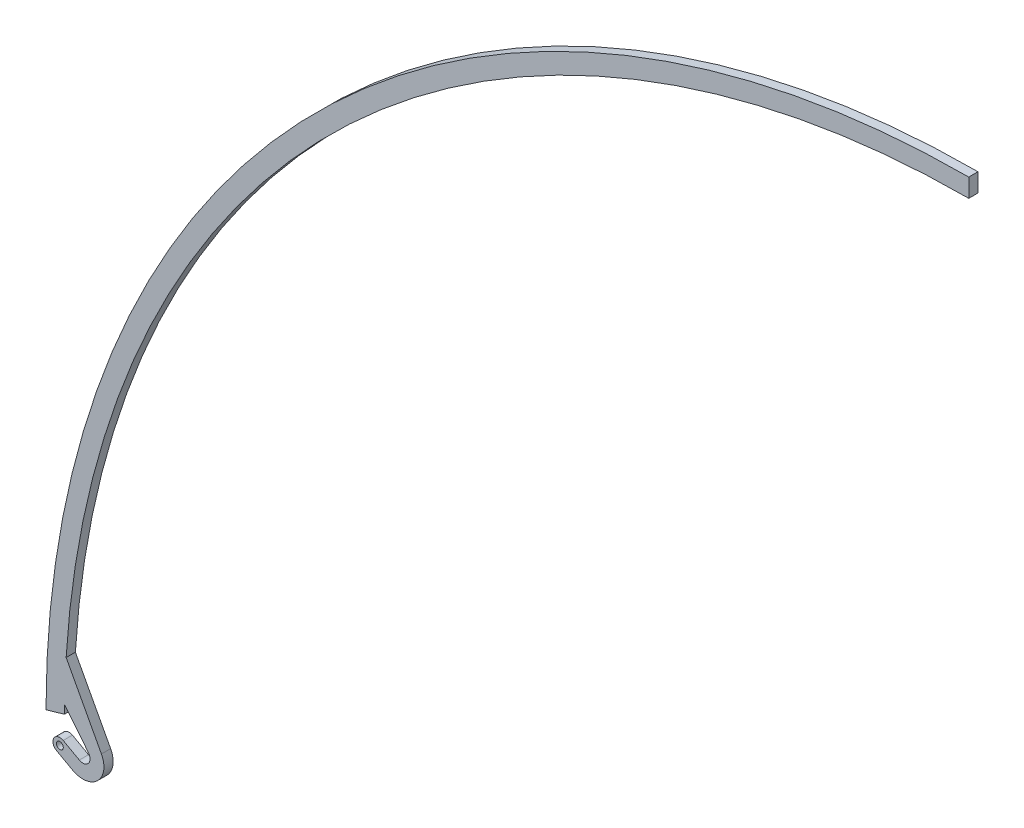
ISO-10303-21;
HEADER;
FILE_DESCRIPTION(('STEP AP214'),'2;1');
FILE_NAME('part.step','',(''),(''),'','','');
FILE_SCHEMA(('AUTOMOTIVE_DESIGN { 1 0 10303 214 1 1 1 1 }'));
ENDSEC;
DATA;
#1=APPLICATION_CONTEXT('core data for automotive mechanical design processes');
#2=APPLICATION_PROTOCOL_DEFINITION('international standard','automotive_design',2000,#1);
#3=PRODUCT_CONTEXT('',#1,'mechanical');
#4=PRODUCT('Part','Part','',(#3));
#5=PRODUCT_RELATED_PRODUCT_CATEGORY('part','',(#4));
#6=PRODUCT_DEFINITION_FORMATION('','',#4);
#7=PRODUCT_DEFINITION_CONTEXT('part definition',#1,'design');
#8=PRODUCT_DEFINITION('design','',#6,#7);
#9=PRODUCT_DEFINITION_SHAPE('','',#8);
#10=(LENGTH_UNIT() NAMED_UNIT(*) SI_UNIT(.MILLI.,.METRE.));
#11=(NAMED_UNIT(*) PLANE_ANGLE_UNIT() SI_UNIT($,.RADIAN.));
#12=(NAMED_UNIT(*) SI_UNIT($,.STERADIAN.) SOLID_ANGLE_UNIT());
#13=UNCERTAINTY_MEASURE_WITH_UNIT(LENGTH_MEASURE(1.E-05),#10,'distance_accuracy_value','');
#14=(GEOMETRIC_REPRESENTATION_CONTEXT(3) GLOBAL_UNCERTAINTY_ASSIGNED_CONTEXT((#13)) GLOBAL_UNIT_ASSIGNED_CONTEXT((#10,
#11,#12)) REPRESENTATION_CONTEXT('',''));
#15=CARTESIAN_POINT('',(0.,0.,0.));
#16=DIRECTION('',(0.,0.,1.));
#17=DIRECTION('',(1.,0.,0.));
#18=AXIS2_PLACEMENT_3D('',#15,#16,#17);
#19=CARTESIAN_POINT('',(1000.,0.,5.));
#20=DIRECTION('',(0.,0.,-1.));
#21=DIRECTION('',(-1.,0.,0.));
#22=AXIS2_PLACEMENT_3D('',#19,#20,#21);
#23=PLANE('',#22);
#24=CARTESIAN_POINT('',(1000.,0.,5.));
#25=DIRECTION('',(0.,0.,1.));
#26=DIRECTION('',(-1.,0.,0.));
#27=AXIS2_PLACEMENT_3D('',#24,#25,#26);
#28=CIRCLE('',#27,1000.);
#29=CARTESIAN_POINT('',(1000.,1000.,5.));
#30=VERTEX_POINT('',#29);
#31=CARTESIAN_POINT('',(0.,0.,5.));
#32=VERTEX_POINT('',#31);
#33=EDGE_CURVE('E178',#30,#32,#28,.T.);
#34=ORIENTED_EDGE('',*,*,#33,.T.);
#35=DIRECTION('',(0.960205519154308,0.279294398414302,0.));
#36=VECTOR('',#35,1.);
#37=CARTESIAN_POINT('',(0.,0.,5.));
#38=LINE('',#37,#36);
#39=CARTESIAN_POINT('',(20.0172963575438,5.82241888068397,5.));
#40=VERTEX_POINT('',#39);
#41=EDGE_CURVE('E106',#32,#40,#38,.T.);
#42=ORIENTED_EDGE('',*,*,#41,.T.);
#43=CARTESIAN_POINT('',(1000.,0.,5.));
#44=DIRECTION('',(0.,0.,-1.));
#45=DIRECTION('',(-1.,0.,0.));
#46=AXIS2_PLACEMENT_3D('',#43,#44,#45);
#47=CIRCLE('',#46,980.);
#48=CARTESIAN_POINT('',(20.114802642677,15.,5.));
#49=VERTEX_POINT('',#48);
#50=EDGE_CURVE('E205',#40,#49,#47,.T.);
#51=ORIENTED_EDGE('',*,*,#50,.T.);
#52=DIRECTION('',(0.626003210329873,-0.779820479762293,0.));
#53=VECTOR('',#52,1.);
#54=CARTESIAN_POINT('',(46.0293760883713,-17.2821269344728,5.));
#55=LINE('',#54,#53);
#56=CARTESIAN_POINT('',(46.0293760883713,-17.2821269344728,5.));
#57=VERTEX_POINT('',#56);
#58=EDGE_CURVE('E224',#49,#57,#55,.T.);
#59=ORIENTED_EDGE('',*,*,#58,.T.);
#60=CARTESIAN_POINT('',(39.896639432353,-22.2051995318293,5.));
#61=DIRECTION('',(0.,0.,-1.));
#62=DIRECTION('',(1.,0.,0.));
#63=AXIS2_PLACEMENT_3D('',#60,#61,#62);
#64=CIRCLE('',#63,7.86429289198417);
#65=CARTESIAN_POINT('',(36.0925255550079,-29.0882090697498,5.));
#66=VERTEX_POINT('',#65);
#67=EDGE_CURVE('E221',#57,#66,#64,.T.);
#68=ORIENTED_EDGE('',*,*,#67,.T.);
#69=DIRECTION('',(-0.87522293897981,0.483719760898337,0.));
#70=VECTOR('',#69,1.);
#71=CARTESIAN_POINT('',(18.6278982067375,-19.4358279576514,5.));
#72=LINE('',#71,#70);
#73=CARTESIAN_POINT('',(18.6278982067375,-19.4358279576514,5.));
#74=VERTEX_POINT('',#73);
#75=EDGE_CURVE('E223',#66,#74,#72,.T.);
#76=ORIENTED_EDGE('',*,*,#75,.T.);
#77=CARTESIAN_POINT('',(15.,-26.,5.));
#78=DIRECTION('',(0.,0.,1.));
#79=DIRECTION('',(1.,0.,0.));
#80=AXIS2_PLACEMENT_3D('',#77,#78,#79);
#81=CIRCLE('',#80,7.5);
#82=CARTESIAN_POINT('',(11.3721017932625,-32.5641720423486,5.));
#83=VERTEX_POINT('',#82);
#84=EDGE_CURVE('E226',#74,#83,#81,.T.);
#85=ORIENTED_EDGE('',*,*,#84,.T.);
#86=DIRECTION('',(0.87522293897981,-0.483719760898336,0.));
#87=VECTOR('',#86,1.);
#88=CARTESIAN_POINT('',(11.3721017932625,-32.5641720423486,5.));
#89=LINE('',#88,#87);
#90=CARTESIAN_POINT('',(28.8367291415329,-42.2165531544469,5.));
#91=VERTEX_POINT('',#90);
#92=EDGE_CURVE('E232',#83,#91,#89,.T.);
#93=ORIENTED_EDGE('',*,*,#92,.T.);
#94=CARTESIAN_POINT('',(39.896639432353,-22.2051995318293,5.));
#95=DIRECTION('',(0.,0.,1.));
#96=DIRECTION('',(1.,0.,0.));
#97=AXIS2_PLACEMENT_3D('',#94,#95,#96);
#98=CIRCLE('',#97,22.8642928919842);
#99=CARTESIAN_POINT('',(60.0559642870194,-11.4173586517243,5.));
#100=VERTEX_POINT('',#99);
#101=EDGE_CURVE('E137',#91,#100,#98,.T.);
#102=ORIENTED_EDGE('',*,*,#101,.T.);
#103=DIRECTION('',(-0.471820446451989,0.881694655938123,0.));
#104=VECTOR('',#103,1.);
#105=CARTESIAN_POINT('',(60.0559642870194,-11.4173586517243,5.));
#106=LINE('',#105,#104);
#107=CARTESIAN_POINT('',(21.8384591490013,60.,5.));
#108=VERTEX_POINT('',#107);
#109=EDGE_CURVE('E131',#100,#108,#106,.T.);
#110=ORIENTED_EDGE('',*,*,#109,.T.);
#111=CARTESIAN_POINT('',(1000.,0.,5.));
#112=DIRECTION('',(0.,0.,-1.));
#113=DIRECTION('',(-1.,0.,0.));
#114=AXIS2_PLACEMENT_3D('',#111,#112,#113);
#115=CIRCLE('',#114,980.);
#116=CARTESIAN_POINT('',(1000.,980.,5.));
#117=VERTEX_POINT('',#116);
#118=EDGE_CURVE('E135',#108,#117,#115,.T.);
#119=ORIENTED_EDGE('',*,*,#118,.T.);
#120=DIRECTION('',(0.,1.,0.));
#121=VECTOR('',#120,1.);
#122=CARTESIAN_POINT('',(1000.,980.,5.));
#123=LINE('',#122,#121);
#124=EDGE_CURVE('E51',#117,#30,#123,.T.);
#125=ORIENTED_EDGE('',*,*,#124,.T.);
#126=EDGE_LOOP('',(#34,#42,#51,#59,#68,#76,#85,#93,#102,#110,#119,#125));
#127=FACE_BOUND('',#126,.T.);
#128=CARTESIAN_POINT('',(15.,-26.,5.));
#129=DIRECTION('',(0.,0.,1.));
#130=DIRECTION('',(1.,0.,0.));
#131=AXIS2_PLACEMENT_3D('',#128,#129,#130);
#132=CIRCLE('',#131,3.75);
#133=CARTESIAN_POINT('',(18.75,-26.,5.));
#134=VERTEX_POINT('',#133);
#135=EDGE_CURVE('E159',#134,#134,#132,.T.);
#136=ORIENTED_EDGE('',*,*,#135,.F.);
#137=EDGE_LOOP('',(#136));
#138=FACE_BOUND('',#137,.T.);
#139=ADVANCED_FACE('F34',(#127,#138),#23,.F.);
#140=CARTESIAN_POINT('',(1000.,0.,-5.));
#141=DIRECTION('',(0.,0.,-1.));
#142=DIRECTION('',(-1.,0.,0.));
#143=AXIS2_PLACEMENT_3D('',#140,#141,#142);
#144=PLANE('',#143);
#145=CARTESIAN_POINT('',(1000.,0.,-5.));
#146=DIRECTION('',(0.,0.,1.));
#147=DIRECTION('',(-1.,0.,0.));
#148=AXIS2_PLACEMENT_3D('',#145,#146,#147);
#149=CIRCLE('',#148,1000.);
#150=CARTESIAN_POINT('',(1000.,1000.,-5.));
#151=VERTEX_POINT('',#150);
#152=CARTESIAN_POINT('',(0.,0.,-5.));
#153=VERTEX_POINT('',#152);
#154=EDGE_CURVE('E155',#151,#153,#149,.T.);
#155=ORIENTED_EDGE('',*,*,#154,.F.);
#156=DIRECTION('',(0.,1.,0.));
#157=VECTOR('',#156,1.);
#158=CARTESIAN_POINT('',(1000.,980.,-5.));
#159=LINE('',#158,#157);
#160=CARTESIAN_POINT('',(1000.,980.,-5.));
#161=VERTEX_POINT('',#160);
#162=EDGE_CURVE('E98',#161,#151,#159,.T.);
#163=ORIENTED_EDGE('',*,*,#162,.F.);
#164=CARTESIAN_POINT('',(1000.,0.,-5.));
#165=DIRECTION('',(0.,0.,-1.));
#166=DIRECTION('',(-1.,0.,0.));
#167=AXIS2_PLACEMENT_3D('',#164,#165,#166);
#168=CIRCLE('',#167,980.);
#169=CARTESIAN_POINT('',(21.8384591490013,60.,-5.));
#170=VERTEX_POINT('',#169);
#171=EDGE_CURVE('E92',#170,#161,#168,.T.);
#172=ORIENTED_EDGE('',*,*,#171,.F.);
#173=DIRECTION('',(-0.471820446451989,0.881694655938123,0.));
#174=VECTOR('',#173,1.);
#175=CARTESIAN_POINT('',(60.0559642870194,-11.4173586517243,-5.));
#176=LINE('',#175,#174);
#177=CARTESIAN_POINT('',(60.0559642870194,-11.4173586517243,-5.));
#178=VERTEX_POINT('',#177);
#179=EDGE_CURVE('E145',#178,#170,#176,.T.);
#180=ORIENTED_EDGE('',*,*,#179,.F.);
#181=CARTESIAN_POINT('',(39.896639432353,-22.2051995318293,-5.));
#182=DIRECTION('',(0.,0.,1.));
#183=DIRECTION('',(1.,0.,0.));
#184=AXIS2_PLACEMENT_3D('',#181,#182,#183);
#185=CIRCLE('',#184,22.8642928919842);
#186=CARTESIAN_POINT('',(28.8367291415329,-42.2165531544469,-5.));
#187=VERTEX_POINT('',#186);
#188=EDGE_CURVE('E173',#187,#178,#185,.T.);
#189=ORIENTED_EDGE('',*,*,#188,.F.);
#190=DIRECTION('',(0.87522293897981,-0.483719760898336,0.));
#191=VECTOR('',#190,1.);
#192=CARTESIAN_POINT('',(11.3721017932625,-32.5641720423486,-5.));
#193=LINE('',#192,#191);
#194=CARTESIAN_POINT('',(11.3721017932625,-32.5641720423486,-5.));
#195=VERTEX_POINT('',#194);
#196=EDGE_CURVE('E171',#195,#187,#193,.T.);
#197=ORIENTED_EDGE('',*,*,#196,.F.);
#198=CARTESIAN_POINT('',(15.,-26.,-5.));
#199=DIRECTION('',(0.,0.,1.));
#200=DIRECTION('',(1.,0.,0.));
#201=AXIS2_PLACEMENT_3D('',#198,#199,#200);
#202=CIRCLE('',#201,7.5);
#203=CARTESIAN_POINT('',(18.6278982067375,-19.4358279576514,-5.));
#204=VERTEX_POINT('',#203);
#205=EDGE_CURVE('E169',#204,#195,#202,.T.);
#206=ORIENTED_EDGE('',*,*,#205,.F.);
#207=DIRECTION('',(-0.87522293897981,0.483719760898337,0.));
#208=VECTOR('',#207,1.);
#209=CARTESIAN_POINT('',(18.6278982067375,-19.4358279576514,-5.));
#210=LINE('',#209,#208);
#211=CARTESIAN_POINT('',(36.0925255550079,-29.0882090697498,-5.));
#212=VERTEX_POINT('',#211);
#213=EDGE_CURVE('E167',#212,#204,#210,.T.);
#214=ORIENTED_EDGE('',*,*,#213,.F.);
#215=CARTESIAN_POINT('',(39.896639432353,-22.2051995318293,-5.));
#216=DIRECTION('',(0.,0.,-1.));
#217=DIRECTION('',(1.,0.,0.));
#218=AXIS2_PLACEMENT_3D('',#215,#216,#217);
#219=CIRCLE('',#218,7.86429289198417);
#220=CARTESIAN_POINT('',(46.0293760883713,-17.2821269344728,-5.));
#221=VERTEX_POINT('',#220);
#222=EDGE_CURVE('E165',#221,#212,#219,.T.);
#223=ORIENTED_EDGE('',*,*,#222,.F.);
#224=DIRECTION('',(0.626003210329873,-0.779820479762293,0.));
#225=VECTOR('',#224,1.);
#226=CARTESIAN_POINT('',(46.0293760883713,-17.2821269344728,-5.));
#227=LINE('',#226,#225);
#228=CARTESIAN_POINT('',(20.114802642677,15.,-5.));
#229=VERTEX_POINT('',#228);
#230=EDGE_CURVE('E163',#229,#221,#227,.T.);
#231=ORIENTED_EDGE('',*,*,#230,.F.);
#232=CARTESIAN_POINT('',(1000.,0.,-5.));
#233=DIRECTION('',(0.,0.,-1.));
#234=DIRECTION('',(-1.,0.,0.));
#235=AXIS2_PLACEMENT_3D('',#232,#233,#234);
#236=CIRCLE('',#235,980.);
#237=CARTESIAN_POINT('',(20.0172963575438,5.82241888068397,-5.));
#238=VERTEX_POINT('',#237);
#239=EDGE_CURVE('E161',#238,#229,#236,.T.);
#240=ORIENTED_EDGE('',*,*,#239,.F.);
#241=DIRECTION('',(0.960205519154308,0.279294398414302,0.));
#242=VECTOR('',#241,1.);
#243=CARTESIAN_POINT('',(0.,0.,-5.));
#244=LINE('',#243,#242);
#245=EDGE_CURVE('E158',#153,#238,#244,.T.);
#246=ORIENTED_EDGE('',*,*,#245,.F.);
#247=EDGE_LOOP('',(#155,#163,#172,#180,#189,#197,#206,#214,#223,#231,#240,#246));
#248=FACE_BOUND('',#247,.T.);
#249=CARTESIAN_POINT('',(15.,-26.,-5.));
#250=DIRECTION('',(0.,0.,1.));
#251=DIRECTION('',(1.,0.,0.));
#252=AXIS2_PLACEMENT_3D('',#249,#250,#251);
#253=CIRCLE('',#252,3.75);
#254=CARTESIAN_POINT('',(18.75,-26.,-5.));
#255=VERTEX_POINT('',#254);
#256=EDGE_CURVE('E379',#255,#255,#253,.T.);
#257=ORIENTED_EDGE('',*,*,#256,.T.);
#258=EDGE_LOOP('',(#257));
#259=FACE_BOUND('',#258,.T.);
#260=ADVANCED_FACE('F209',(#248,#259),#144,.T.);
#261=CARTESIAN_POINT('',(1000.,0.,5.));
#262=DIRECTION('',(0.,0.,-1.));
#263=DIRECTION('',(-1.,0.,0.));
#264=AXIS2_PLACEMENT_3D('',#261,#262,#263);
#265=CYLINDRICAL_SURFACE('',#264,1000.);
#266=ORIENTED_EDGE('',*,*,#154,.T.);
#267=DIRECTION('',(0.,0.,-1.));
#268=VECTOR('',#267,1.);
#269=CARTESIAN_POINT('',(0.,0.,5.));
#270=LINE('',#269,#268);
#271=EDGE_CURVE('E11',#32,#153,#270,.T.);
#272=ORIENTED_EDGE('',*,*,#271,.F.);
#273=ORIENTED_EDGE('',*,*,#33,.F.);
#274=DIRECTION('',(0.,0.,-1.));
#275=VECTOR('',#274,1.);
#276=CARTESIAN_POINT('',(1000.,1000.,5.));
#277=LINE('',#276,#275);
#278=EDGE_CURVE('E151',#30,#151,#277,.T.);
#279=ORIENTED_EDGE('',*,*,#278,.T.);
#280=EDGE_LOOP('',(#266,#272,#273,#279));
#281=FACE_BOUND('',#280,.T.);
#282=ADVANCED_FACE('F36',(#281),#265,.T.);
#283=CARTESIAN_POINT('',(0.,0.,5.));
#284=DIRECTION('',(-0.279294398414302,0.960205519154308,0.));
#285=DIRECTION('',(-0.960205519154308,-0.279294398414302,0.));
#286=AXIS2_PLACEMENT_3D('',#283,#284,#285);
#287=PLANE('',#286);
#288=ORIENTED_EDGE('',*,*,#245,.T.);
#289=DIRECTION('',(0.,0.,-1.));
#290=VECTOR('',#289,1.);
#291=CARTESIAN_POINT('',(20.0172963575438,5.82241888068397,5.));
#292=LINE('',#291,#290);
#293=EDGE_CURVE('E43',#40,#238,#292,.T.);
#294=ORIENTED_EDGE('',*,*,#293,.F.);
#295=ORIENTED_EDGE('',*,*,#41,.F.);
#296=ORIENTED_EDGE('',*,*,#271,.T.);
#297=EDGE_LOOP('',(#288,#294,#295,#296));
#298=FACE_BOUND('',#297,.T.);
#299=ADVANCED_FACE('F266',(#298),#287,.F.);
#300=CARTESIAN_POINT('',(1000.,0.,5.));
#301=DIRECTION('',(0.,0.,-1.));
#302=DIRECTION('',(-1.,0.,0.));
#303=AXIS2_PLACEMENT_3D('',#300,#301,#302);
#304=CYLINDRICAL_SURFACE('',#303,980.);
#305=ORIENTED_EDGE('',*,*,#239,.T.);
#306=DIRECTION('',(0.,0.,-1.));
#307=VECTOR('',#306,1.);
#308=CARTESIAN_POINT('',(20.114802642677,15.,5.));
#309=LINE('',#308,#307);
#310=EDGE_CURVE('E197',#49,#229,#309,.T.);
#311=ORIENTED_EDGE('',*,*,#310,.F.);
#312=ORIENTED_EDGE('',*,*,#50,.F.);
#313=ORIENTED_EDGE('',*,*,#293,.T.);
#314=EDGE_LOOP('',(#305,#311,#312,#313));
#315=FACE_BOUND('',#314,.T.);
#316=ADVANCED_FACE('F203',(#315),#304,.F.);
#317=CARTESIAN_POINT('',(46.0293760883713,-17.2821269344728,5.));
#318=DIRECTION('',(0.779820479762293,0.626003210329873,0.));
#319=DIRECTION('',(-0.626003210329873,0.779820479762293,0.));
#320=AXIS2_PLACEMENT_3D('',#317,#318,#319);
#321=PLANE('',#320);
#322=ORIENTED_EDGE('',*,*,#230,.T.);
#323=DIRECTION('',(0.,0.,-1.));
#324=VECTOR('',#323,1.);
#325=CARTESIAN_POINT('',(46.0293760883713,-17.2821269344728,5.));
#326=LINE('',#325,#324);
#327=EDGE_CURVE('E194',#57,#221,#326,.T.);
#328=ORIENTED_EDGE('',*,*,#327,.F.);
#329=ORIENTED_EDGE('',*,*,#58,.F.);
#330=ORIENTED_EDGE('',*,*,#310,.T.);
#331=EDGE_LOOP('',(#322,#328,#329,#330));
#332=FACE_BOUND('',#331,.T.);
#333=ADVANCED_FACE('F215',(#332),#321,.F.);
#334=CARTESIAN_POINT('',(39.896639432353,-22.2051995318293,5.));
#335=DIRECTION('',(0.,0.,-1.));
#336=DIRECTION('',(-1.,0.,0.));
#337=AXIS2_PLACEMENT_3D('',#334,#335,#336);
#338=CYLINDRICAL_SURFACE('',#337,7.86429289198417);
#339=ORIENTED_EDGE('',*,*,#222,.T.);
#340=DIRECTION('',(0.,0.,-1.));
#341=VECTOR('',#340,1.);
#342=CARTESIAN_POINT('',(36.0925255550079,-29.0882090697498,5.));
#343=LINE('',#342,#341);
#344=EDGE_CURVE('E191',#66,#212,#343,.T.);
#345=ORIENTED_EDGE('',*,*,#344,.F.);
#346=ORIENTED_EDGE('',*,*,#67,.F.);
#347=ORIENTED_EDGE('',*,*,#327,.T.);
#348=EDGE_LOOP('',(#339,#345,#346,#347));
#349=FACE_BOUND('',#348,.T.);
#350=ADVANCED_FACE('F219',(#349),#338,.F.);
#351=CARTESIAN_POINT('',(18.6278982067375,-19.4358279576514,5.));
#352=DIRECTION('',(-0.483719760898337,-0.87522293897981,0.));
#353=DIRECTION('',(0.87522293897981,-0.483719760898337,0.));
#354=AXIS2_PLACEMENT_3D('',#351,#352,#353);
#355=PLANE('',#354);
#356=ORIENTED_EDGE('',*,*,#213,.T.);
#357=DIRECTION('',(0.,0.,-1.));
#358=VECTOR('',#357,1.);
#359=CARTESIAN_POINT('',(18.6278982067375,-19.4358279576514,5.));
#360=LINE('',#359,#358);
#361=EDGE_CURVE('E188',#74,#204,#360,.T.);
#362=ORIENTED_EDGE('',*,*,#361,.F.);
#363=ORIENTED_EDGE('',*,*,#75,.F.);
#364=ORIENTED_EDGE('',*,*,#344,.T.);
#365=EDGE_LOOP('',(#356,#362,#363,#364));
#366=FACE_BOUND('',#365,.T.);
#367=ADVANCED_FACE('F279',(#366),#355,.F.);
#368=CARTESIAN_POINT('',(15.,-26.,5.));
#369=DIRECTION('',(0.,0.,-1.));
#370=DIRECTION('',(-1.,0.,0.));
#371=AXIS2_PLACEMENT_3D('',#368,#369,#370);
#372=CYLINDRICAL_SURFACE('',#371,7.5);
#373=ORIENTED_EDGE('',*,*,#205,.T.);
#374=DIRECTION('',(0.,0.,-1.));
#375=VECTOR('',#374,1.);
#376=CARTESIAN_POINT('',(11.3721017932625,-32.5641720423486,5.));
#377=LINE('',#376,#375);
#378=EDGE_CURVE('E185',#83,#195,#377,.T.);
#379=ORIENTED_EDGE('',*,*,#378,.F.);
#380=ORIENTED_EDGE('',*,*,#84,.F.);
#381=ORIENTED_EDGE('',*,*,#361,.T.);
#382=EDGE_LOOP('',(#373,#379,#380,#381));
#383=FACE_BOUND('',#382,.T.);
#384=ADVANCED_FACE('F282',(#383),#372,.T.);
#385=CARTESIAN_POINT('',(11.3721017932625,-32.5641720423486,5.));
#386=DIRECTION('',(0.483719760898336,0.87522293897981,0.));
#387=DIRECTION('',(-0.87522293897981,0.483719760898336,0.));
#388=AXIS2_PLACEMENT_3D('',#385,#386,#387);
#389=PLANE('',#388);
#390=ORIENTED_EDGE('',*,*,#196,.T.);
#391=DIRECTION('',(0.,0.,-1.));
#392=VECTOR('',#391,1.);
#393=CARTESIAN_POINT('',(28.8367291415329,-42.2165531544469,5.));
#394=LINE('',#393,#392);
#395=EDGE_CURVE('E182',#91,#187,#394,.T.);
#396=ORIENTED_EDGE('',*,*,#395,.F.);
#397=ORIENTED_EDGE('',*,*,#92,.F.);
#398=ORIENTED_EDGE('',*,*,#378,.T.);
#399=EDGE_LOOP('',(#390,#396,#397,#398));
#400=FACE_BOUND('',#399,.T.);
#401=ADVANCED_FACE('F238',(#400),#389,.F.);
#402=CARTESIAN_POINT('',(39.896639432353,-22.2051995318293,5.));
#403=DIRECTION('',(0.,0.,-1.));
#404=DIRECTION('',(-1.,0.,0.));
#405=AXIS2_PLACEMENT_3D('',#402,#403,#404);
#406=CYLINDRICAL_SURFACE('',#405,22.8642928919842);
#407=ORIENTED_EDGE('',*,*,#188,.T.);
#408=DIRECTION('',(0.,0.,-1.));
#409=VECTOR('',#408,1.);
#410=CARTESIAN_POINT('',(60.0559642870194,-11.4173586517243,5.));
#411=LINE('',#410,#409);
#412=EDGE_CURVE('E146',#100,#178,#411,.T.);
#413=ORIENTED_EDGE('',*,*,#412,.F.);
#414=ORIENTED_EDGE('',*,*,#101,.F.);
#415=ORIENTED_EDGE('',*,*,#395,.T.);
#416=EDGE_LOOP('',(#407,#413,#414,#415));
#417=FACE_BOUND('',#416,.T.);
#418=ADVANCED_FACE('F242',(#417),#406,.T.);
#419=CARTESIAN_POINT('',(60.0559642870194,-11.4173586517243,5.));
#420=DIRECTION('',(-0.881694655938123,-0.471820446451989,0.));
#421=DIRECTION('',(0.471820446451989,-0.881694655938123,0.));
#422=AXIS2_PLACEMENT_3D('',#419,#420,#421);
#423=PLANE('',#422);
#424=ORIENTED_EDGE('',*,*,#179,.T.);
#425=DIRECTION('',(0.,0.,-1.));
#426=VECTOR('',#425,1.);
#427=CARTESIAN_POINT('',(21.8384591490013,60.,5.));
#428=LINE('',#427,#426);
#429=EDGE_CURVE('E142',#108,#170,#428,.T.);
#430=ORIENTED_EDGE('',*,*,#429,.F.);
#431=ORIENTED_EDGE('',*,*,#109,.F.);
#432=ORIENTED_EDGE('',*,*,#412,.T.);
#433=EDGE_LOOP('',(#424,#430,#431,#432));
#434=FACE_BOUND('',#433,.T.);
#435=ADVANCED_FACE('F143',(#434),#423,.F.);
#436=CARTESIAN_POINT('',(1000.,0.,5.));
#437=DIRECTION('',(0.,0.,-1.));
#438=DIRECTION('',(-1.,0.,0.));
#439=AXIS2_PLACEMENT_3D('',#436,#437,#438);
#440=CYLINDRICAL_SURFACE('',#439,980.);
#441=ORIENTED_EDGE('',*,*,#171,.T.);
#442=DIRECTION('',(0.,0.,-1.));
#443=VECTOR('',#442,1.);
#444=CARTESIAN_POINT('',(1000.,980.,5.));
#445=LINE('',#444,#443);
#446=EDGE_CURVE('E147',#117,#161,#445,.T.);
#447=ORIENTED_EDGE('',*,*,#446,.F.);
#448=ORIENTED_EDGE('',*,*,#118,.F.);
#449=ORIENTED_EDGE('',*,*,#429,.T.);
#450=EDGE_LOOP('',(#441,#447,#448,#449));
#451=FACE_BOUND('',#450,.T.);
#452=ADVANCED_FACE('F149',(#451),#440,.F.);
#453=CARTESIAN_POINT('',(1000.,980.,5.));
#454=DIRECTION('',(-1.,0.,0.));
#455=DIRECTION('',(0.,0.,1.));
#456=AXIS2_PLACEMENT_3D('',#453,#454,#455);
#457=PLANE('',#456);
#458=ORIENTED_EDGE('',*,*,#162,.T.);
#459=ORIENTED_EDGE('',*,*,#278,.F.);
#460=ORIENTED_EDGE('',*,*,#124,.F.);
#461=ORIENTED_EDGE('',*,*,#446,.T.);
#462=EDGE_LOOP('',(#458,#459,#460,#461));
#463=FACE_BOUND('',#462,.T.);
#464=ADVANCED_FACE('F246',(#463),#457,.F.);
#465=CARTESIAN_POINT('',(15.,-26.,5.));
#466=DIRECTION('',(0.,0.,-1.));
#467=DIRECTION('',(-1.,0.,0.));
#468=AXIS2_PLACEMENT_3D('',#465,#466,#467);
#469=CYLINDRICAL_SURFACE('',#468,3.75);
#470=ORIENTED_EDGE('',*,*,#135,.T.);
#471=EDGE_LOOP('',(#470));
#472=FACE_BOUND('',#471,.T.);
#473=ORIENTED_EDGE('',*,*,#256,.F.);
#474=EDGE_LOOP('',(#473));
#475=FACE_BOUND('',#474,.T.);
#476=ADVANCED_FACE('F248',(#472,#475),#469,.F.);
#477=CLOSED_SHELL('',(#139,#260,#282,#299,#316,#333,#350,#367,#384,#401,#418,#435,#452,#464,#476));
#478=MANIFOLD_SOLID_BREP('B2',#477);
#479=ADVANCED_BREP_SHAPE_REPRESENTATION('',(#18,#478),#14);
#480=SHAPE_DEFINITION_REPRESENTATION(#9,#479);
ENDSEC;
END-ISO-10303-21;
